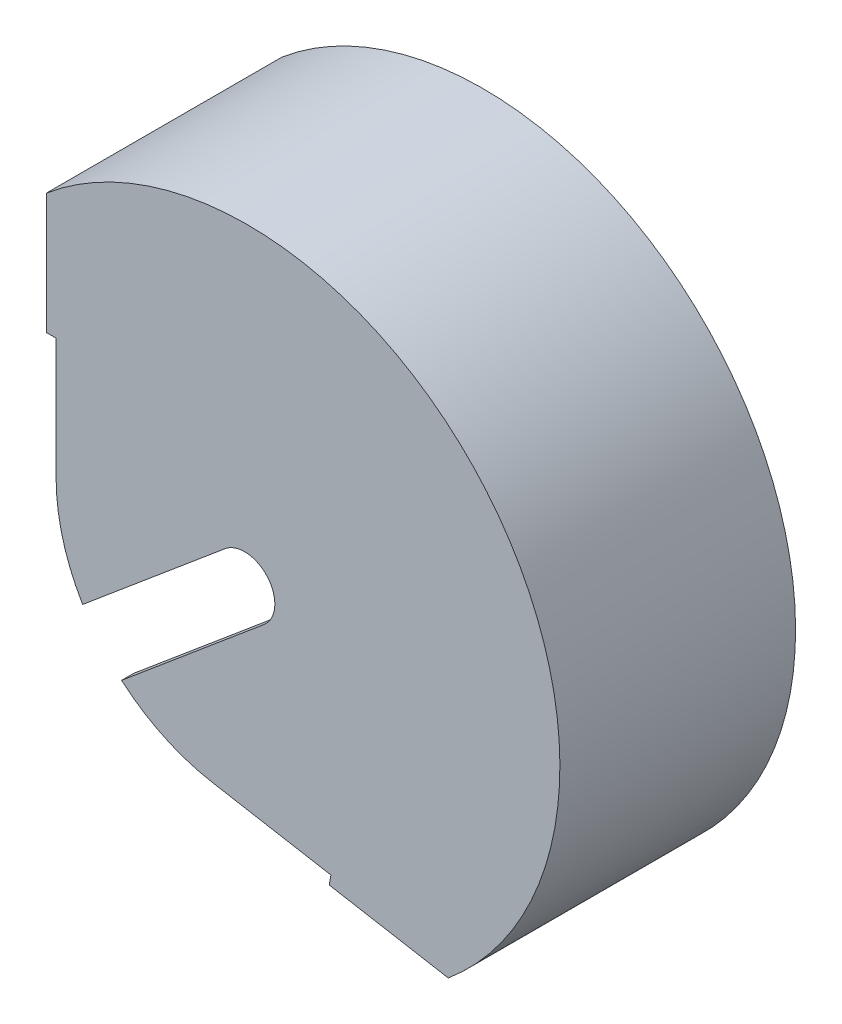
ISO-10303-21;
HEADER;
FILE_DESCRIPTION(('STEP AP214'),'2;1');
FILE_NAME('part.step','',(''),(''),'','','');
FILE_SCHEMA(('AUTOMOTIVE_DESIGN { 1 0 10303 214 1 1 1 1 }'));
ENDSEC;
DATA;
#1=APPLICATION_CONTEXT('core data for automotive mechanical design processes');
#2=APPLICATION_PROTOCOL_DEFINITION('international standard','automotive_design',2000,#1);
#3=PRODUCT_CONTEXT('',#1,'mechanical');
#4=PRODUCT('Part','Part','',(#3));
#5=PRODUCT_RELATED_PRODUCT_CATEGORY('part','',(#4));
#6=PRODUCT_DEFINITION_FORMATION('','',#4);
#7=PRODUCT_DEFINITION_CONTEXT('part definition',#1,'design');
#8=PRODUCT_DEFINITION('design','',#6,#7);
#9=PRODUCT_DEFINITION_SHAPE('','',#8);
#10=(LENGTH_UNIT() NAMED_UNIT(*) SI_UNIT(.MILLI.,.METRE.));
#11=(NAMED_UNIT(*) PLANE_ANGLE_UNIT() SI_UNIT($,.RADIAN.));
#12=(NAMED_UNIT(*) SI_UNIT($,.STERADIAN.) SOLID_ANGLE_UNIT());
#13=UNCERTAINTY_MEASURE_WITH_UNIT(LENGTH_MEASURE(1.E-05),#10,'distance_accuracy_value','');
#14=(GEOMETRIC_REPRESENTATION_CONTEXT(3) GLOBAL_UNCERTAINTY_ASSIGNED_CONTEXT((#13)) GLOBAL_UNIT_ASSIGNED_CONTEXT((#10,
#11,#12)) REPRESENTATION_CONTEXT('',''));
#15=CARTESIAN_POINT('',(0.,0.,0.));
#16=DIRECTION('',(0.,0.,1.));
#17=DIRECTION('',(1.,0.,0.));
#18=AXIS2_PLACEMENT_3D('',#15,#16,#17);
#19=CARTESIAN_POINT('',(0.,0.,46.99));
#20=DIRECTION('',(0.,0.,1.));
#21=DIRECTION('',(1.,0.,0.));
#22=AXIS2_PLACEMENT_3D('',#19,#20,#21);
#23=CYLINDRICAL_SURFACE('',#22,39.624);
#24=DIRECTION('',(0.,0.,1.));
#25=VECTOR('',#24,1.);
#26=CARTESIAN_POINT('',(-34.0431369022995,-20.2762473315773,46.99));
#27=LINE('',#26,#25);
#28=CARTESIAN_POINT('',(-34.0431369022995,-20.2762473315773,46.99));
#29=VERTEX_POINT('',#28);
#30=CARTESIAN_POINT('',(-34.0431369022995,-20.2762473315773,49.53));
#31=VERTEX_POINT('',#30);
#32=EDGE_CURVE('E196',#29,#31,#27,.T.);
#33=ORIENTED_EDGE('',*,*,#32,.T.);
#34=CARTESIAN_POINT('',(0.,0.,49.53));
#35=DIRECTION('',(0.,0.,1.));
#36=DIRECTION('',(1.,0.,0.));
#37=AXIS2_PLACEMENT_3D('',#34,#35,#36);
#38=CIRCLE('',#37,39.624);
#39=CARTESIAN_POINT('',(-39.624,0.,49.53));
#40=VERTEX_POINT('',#39);
#41=EDGE_CURVE('E210',#40,#31,#38,.T.);
#42=ORIENTED_EDGE('',*,*,#41,.F.);
#43=DIRECTION('',(0.,0.,1.));
#44=VECTOR('',#43,1.);
#45=CARTESIAN_POINT('',(-39.624,0.,46.99));
#46=LINE('',#45,#44);
#47=CARTESIAN_POINT('',(-39.624,0.,46.99));
#48=VERTEX_POINT('',#47);
#49=EDGE_CURVE('E234',#48,#40,#46,.T.);
#50=ORIENTED_EDGE('',*,*,#49,.F.);
#51=CARTESIAN_POINT('',(0.,0.,46.99));
#52=DIRECTION('',(0.,0.,1.));
#53=DIRECTION('',(1.,0.,0.));
#54=AXIS2_PLACEMENT_3D('',#51,#52,#53);
#55=CIRCLE('',#54,39.624);
#56=EDGE_CURVE('E212',#48,#29,#55,.T.);
#57=ORIENTED_EDGE('',*,*,#56,.T.);
#58=EDGE_LOOP('',(#33,#42,#50,#57));
#59=FACE_BOUND('',#58,.T.);
#60=ADVANCED_FACE('F44',(#59),#23,.T.);
#61=CARTESIAN_POINT('',(0.,0.,2.54));
#62=DIRECTION('',(0.,0.,1.));
#63=DIRECTION('',(1.,0.,0.));
#64=AXIS2_PLACEMENT_3D('',#61,#62,#63);
#65=PLANE('',#64);
#66=CARTESIAN_POINT('',(0.,0.,2.54));
#67=DIRECTION('',(0.,0.,1.));
#68=DIRECTION('',(1.,0.,0.));
#69=AXIS2_PLACEMENT_3D('',#66,#67,#68);
#70=CIRCLE('',#69,5.08);
#71=CARTESIAN_POINT('',(5.08,0.,2.54));
#72=VERTEX_POINT('',#71);
#73=EDGE_CURVE('E544',#72,#72,#70,.F.);
#74=ORIENTED_EDGE('',*,*,#73,.T.);
#75=EDGE_LOOP('',(#74));
#76=FACE_BOUND('',#75,.T.);
#77=CARTESIAN_POINT('',(2.11621768174401,-33.5316800791596,2.54));
#78=DIRECTION('',(0.,0.,1.));
#79=DIRECTION('',(1.,0.,0.));
#80=AXIS2_PLACEMENT_3D('',#77,#78,#79);
#81=CIRCLE('',#80,3.2639);
#82=CARTESIAN_POINT('',(5.38011768174402,-33.5316800791596,2.54));
#83=VERTEX_POINT('',#82);
#84=EDGE_CURVE('E532',#83,#83,#81,.F.);
#85=ORIENTED_EDGE('',*,*,#84,.T.);
#86=EDGE_LOOP('',(#85));
#87=FACE_BOUND('',#86,.T.);
#88=CARTESIAN_POINT('',(-33.2774928980017,10.1739505809418,2.54));
#89=DIRECTION('',(0.,0.,1.));
#90=DIRECTION('',(1.,0.,0.));
#91=AXIS2_PLACEMENT_3D('',#88,#89,#90);
#92=CIRCLE('',#91,3.2639);
#93=CARTESIAN_POINT('',(-30.0135928980017,10.1739505809418,2.54));
#94=VERTEX_POINT('',#93);
#95=EDGE_CURVE('E528',#94,#94,#92,.F.);
#96=ORIENTED_EDGE('',*,*,#95,.T.);
#97=EDGE_LOOP('',(#96));
#98=FACE_BOUND('',#97,.T.);
#99=CARTESIAN_POINT('',(0.569372682063345,0.477760407521777,2.54));
#100=DIRECTION('',(0.,0.,1.));
#101=DIRECTION('',(1.,0.,0.));
#102=AXIS2_PLACEMENT_3D('',#99,#100,#101);
#103=CIRCLE('',#102,63.1510183795466);
#104=CARTESIAN_POINT('',(41.1620648355229,-47.8987262994342,2.54));
#105=VERTEX_POINT('',#104);
#106=CARTESIAN_POINT('',(-40.0233194713961,48.8542471144778,2.54));
#107=VERTEX_POINT('',#106);
#108=EDGE_CURVE('E68',#105,#107,#103,.T.);
#109=ORIENTED_EDGE('',*,*,#108,.T.);
#110=DIRECTION('',(-1.,0.,0.));
#111=VECTOR('',#110,1.);
#112=CARTESIAN_POINT('',(0.,48.8542471144778,2.54));
#113=LINE('',#112,#111);
#114=CARTESIAN_POINT('',(-41.656,48.8542471144778,2.54));
#115=VERTEX_POINT('',#114);
#116=EDGE_CURVE('E260',#107,#115,#113,.T.);
#117=ORIENTED_EDGE('',*,*,#116,.T.);
#118=DIRECTION('',(0.,1.,0.));
#119=VECTOR('',#118,1.);
#120=CARTESIAN_POINT('',(-41.656,0.,2.54));
#121=LINE('',#120,#119);
#122=CARTESIAN_POINT('',(-41.656,25.4,2.54));
#123=VERTEX_POINT('',#122);
#124=EDGE_CURVE('E308',#123,#115,#121,.T.);
#125=ORIENTED_EDGE('',*,*,#124,.F.);
#126=DIRECTION('',(-1.,0.,0.));
#127=VECTOR('',#126,1.);
#128=CARTESIAN_POINT('',(0.,25.4,2.54));
#129=LINE('',#128,#127);
#130=CARTESIAN_POINT('',(-39.624,25.4,2.54));
#131=VERTEX_POINT('',#130);
#132=EDGE_CURVE('E312',#131,#123,#129,.T.);
#133=ORIENTED_EDGE('',*,*,#132,.F.);
#134=DIRECTION('',(0.,1.,0.));
#135=VECTOR('',#134,1.);
#136=CARTESIAN_POINT('',(-39.624,0.,2.54));
#137=LINE('',#136,#135);
#138=CARTESIAN_POINT('',(-39.624,0.,2.54));
#139=VERTEX_POINT('',#138);
#140=EDGE_CURVE('E291',#139,#131,#137,.T.);
#141=ORIENTED_EDGE('',*,*,#140,.F.);
#142=CARTESIAN_POINT('',(0.,0.,2.54));
#143=DIRECTION('',(0.,0.,1.));
#144=DIRECTION('',(1.,0.,0.));
#145=AXIS2_PLACEMENT_3D('',#142,#143,#144);
#146=CIRCLE('',#145,39.624);
#147=CARTESIAN_POINT('',(-6.88063539187432,-39.0220224053558,2.54));
#148=VERTEX_POINT('',#147);
#149=EDGE_CURVE('E295',#139,#148,#146,.T.);
#150=ORIENTED_EDGE('',*,*,#149,.T.);
#151=DIRECTION('',(0.984807753012209,-0.173648177666927,0.));
#152=VECTOR('',#151,1.);
#153=CARTESIAN_POINT('',(-6.88063539187431,-39.0220224053558,2.54));
#154=LINE('',#153,#152);
#155=CARTESIAN_POINT('',(18.1334815346358,-43.4326861180957,2.54));
#156=VERTEX_POINT('',#155);
#157=EDGE_CURVE('E299',#148,#156,#154,.T.);
#158=ORIENTED_EDGE('',*,*,#157,.T.);
#159=DIRECTION('',(-0.173648177666925,-0.984807753012209,0.));
#160=VECTOR('',#159,1.);
#161=CARTESIAN_POINT('',(25.01411692651,-4.41066371273988,2.54));
#162=LINE('',#161,#160);
#163=CARTESIAN_POINT('',(17.7806284376166,-45.4338154722165,2.54));
#164=VERTEX_POINT('',#163);
#165=EDGE_CURVE('E302',#156,#164,#162,.T.);
#166=ORIENTED_EDGE('',*,*,#165,.T.);
#167=DIRECTION('',(0.984807753012209,-0.173648177666927,0.));
#168=VECTOR('',#167,1.);
#169=CARTESIAN_POINT('',(-7.23348848889351,-41.0231517594766,2.54));
#170=LINE('',#169,#168);
#171=CARTESIAN_POINT('',(40.8785528370185,-49.5066027421954,2.54));
#172=VERTEX_POINT('',#171);
#173=EDGE_CURVE('E305',#164,#172,#170,.T.);
#174=ORIENTED_EDGE('',*,*,#173,.T.);
#175=DIRECTION('',(-0.173648177666925,-0.984807753012209,0.));
#176=VECTOR('',#175,1.);
#177=CARTESIAN_POINT('',(48.112041325912,-8.48345098271867,2.54));
#178=LINE('',#177,#176);
#179=EDGE_CURVE('E270',#105,#172,#178,.T.);
#180=ORIENTED_EDGE('',*,*,#179,.F.);
#181=EDGE_LOOP('',(#109,#117,#125,#133,#141,#150,#158,#166,#174,#180));
#182=FACE_BOUND('',#181,.T.);
#183=ADVANCED_FACE('F388',(#76,#87,#98,#182),#65,.T.);
#184=CARTESIAN_POINT('',(-39.624,0.,2.54));
#185=DIRECTION('',(-1.,0.,0.));
#186=DIRECTION('',(0.,0.,1.));
#187=AXIS2_PLACEMENT_3D('',#184,#185,#186);
#188=PLANE('',#187);
#189=DIRECTION('',(0.,1.,0.));
#190=VECTOR('',#189,1.);
#191=CARTESIAN_POINT('',(-39.624,0.,0.));
#192=LINE('',#191,#190);
#193=CARTESIAN_POINT('',(-39.624,0.,0.));
#194=VERTEX_POINT('',#193);
#195=CARTESIAN_POINT('',(-39.624,25.4,0.));
#196=VERTEX_POINT('',#195);
#197=EDGE_CURVE('E290',#194,#196,#192,.T.);
#198=ORIENTED_EDGE('',*,*,#197,.F.);
#199=DIRECTION('',(0.,0.,-1.));
#200=VECTOR('',#199,1.);
#201=CARTESIAN_POINT('',(-39.624,0.,2.54));
#202=LINE('',#201,#200);
#203=EDGE_CURVE('E11',#139,#194,#202,.T.);
#204=ORIENTED_EDGE('',*,*,#203,.F.);
#205=ORIENTED_EDGE('',*,*,#140,.T.);
#206=DIRECTION('',(0.,0.,-1.));
#207=VECTOR('',#206,1.);
#208=CARTESIAN_POINT('',(-39.624,25.4,2.54));
#209=LINE('',#208,#207);
#210=EDGE_CURVE('E316',#131,#196,#209,.T.);
#211=ORIENTED_EDGE('',*,*,#210,.T.);
#212=EDGE_LOOP('',(#198,#204,#205,#211));
#213=FACE_BOUND('',#212,.T.);
#214=ADVANCED_FACE('F46',(#213),#188,.T.);
#215=CARTESIAN_POINT('',(0.,0.,2.54));
#216=DIRECTION('',(0.,0.,-1.));
#217=DIRECTION('',(-1.,0.,0.));
#218=AXIS2_PLACEMENT_3D('',#215,#216,#217);
#219=CYLINDRICAL_SURFACE('',#218,39.624);
#220=CARTESIAN_POINT('',(0.,0.,0.));
#221=DIRECTION('',(0.,0.,1.));
#222=DIRECTION('',(1.,0.,0.));
#223=AXIS2_PLACEMENT_3D('',#220,#221,#222);
#224=CIRCLE('',#223,39.624);
#225=CARTESIAN_POINT('',(-6.88063539187432,-39.0220224053558,0.));
#226=VERTEX_POINT('',#225);
#227=EDGE_CURVE('E320',#194,#226,#224,.T.);
#228=ORIENTED_EDGE('',*,*,#227,.T.);
#229=DIRECTION('',(0.,0.,-1.));
#230=VECTOR('',#229,1.);
#231=CARTESIAN_POINT('',(-6.88063539187432,-39.0220224053558,2.54));
#232=LINE('',#231,#230);
#233=EDGE_CURVE('E53',#148,#226,#232,.T.);
#234=ORIENTED_EDGE('',*,*,#233,.F.);
#235=ORIENTED_EDGE('',*,*,#149,.F.);
#236=ORIENTED_EDGE('',*,*,#203,.T.);
#237=EDGE_LOOP('',(#228,#234,#235,#236));
#238=FACE_BOUND('',#237,.T.);
#239=ADVANCED_FACE('F411',(#238),#219,.T.);
#240=CARTESIAN_POINT('',(-6.88063539187431,-39.0220224053558,2.54));
#241=DIRECTION('',(0.173648177666927,0.984807753012209,0.));
#242=DIRECTION('',(-0.984807753012209,0.173648177666927,0.));
#243=AXIS2_PLACEMENT_3D('',#240,#241,#242);
#244=PLANE('',#243);
#245=DIRECTION('',(0.984807753012209,-0.173648177666927,0.));
#246=VECTOR('',#245,1.);
#247=CARTESIAN_POINT('',(-6.88063539187431,-39.0220224053558,0.));
#248=LINE('',#247,#246);
#249=CARTESIAN_POINT('',(18.1334815346358,-43.4326861180957,0.));
#250=VERTEX_POINT('',#249);
#251=EDGE_CURVE('E323',#226,#250,#248,.T.);
#252=ORIENTED_EDGE('',*,*,#251,.T.);
#253=DIRECTION('',(0.,0.,-1.));
#254=VECTOR('',#253,1.);
#255=CARTESIAN_POINT('',(18.1334815346358,-43.4326861180957,2.54));
#256=LINE('',#255,#254);
#257=EDGE_CURVE('E359',#156,#250,#256,.T.);
#258=ORIENTED_EDGE('',*,*,#257,.F.);
#259=ORIENTED_EDGE('',*,*,#157,.F.);
#260=ORIENTED_EDGE('',*,*,#233,.T.);
#261=EDGE_LOOP('',(#252,#258,#259,#260));
#262=FACE_BOUND('',#261,.T.);
#263=ADVANCED_FACE('F368',(#262),#244,.F.);
#264=CARTESIAN_POINT('',(25.01411692651,-4.41066371273988,2.54));
#265=DIRECTION('',(0.984807753012209,-0.173648177666925,0.));
#266=DIRECTION('',(0.173648177666925,0.984807753012209,0.));
#267=AXIS2_PLACEMENT_3D('',#264,#265,#266);
#268=PLANE('',#267);
#269=DIRECTION('',(-0.173648177666925,-0.984807753012209,0.));
#270=VECTOR('',#269,1.);
#271=CARTESIAN_POINT('',(25.01411692651,-4.41066371273988,0.));
#272=LINE('',#271,#270);
#273=CARTESIAN_POINT('',(17.7806284376166,-45.4338154722165,0.));
#274=VERTEX_POINT('',#273);
#275=EDGE_CURVE('E326',#250,#274,#272,.T.);
#276=ORIENTED_EDGE('',*,*,#275,.T.);
#277=DIRECTION('',(0.,0.,-1.));
#278=VECTOR('',#277,1.);
#279=CARTESIAN_POINT('',(17.7806284376166,-45.4338154722165,2.54));
#280=LINE('',#279,#278);
#281=EDGE_CURVE('E355',#164,#274,#280,.T.);
#282=ORIENTED_EDGE('',*,*,#281,.F.);
#283=ORIENTED_EDGE('',*,*,#165,.F.);
#284=ORIENTED_EDGE('',*,*,#257,.T.);
#285=EDGE_LOOP('',(#276,#282,#283,#284));
#286=FACE_BOUND('',#285,.T.);
#287=ADVANCED_FACE('F381',(#286),#268,.F.);
#288=CARTESIAN_POINT('',(-7.23348848889351,-41.0231517594766,2.54));
#289=DIRECTION('',(0.173648177666927,0.984807753012209,0.));
#290=DIRECTION('',(-0.984807753012209,0.173648177666927,0.));
#291=AXIS2_PLACEMENT_3D('',#288,#289,#290);
#292=PLANE('',#291);
#293=DIRECTION('',(0.984807753012209,-0.173648177666927,0.));
#294=VECTOR('',#293,1.);
#295=CARTESIAN_POINT('',(-7.23348848889351,-41.0231517594766,0.));
#296=LINE('',#295,#294);
#297=CARTESIAN_POINT('',(42.7947453641267,-49.8444791849564,0.));
#298=VERTEX_POINT('',#297);
#299=EDGE_CURVE('E329',#274,#298,#296,.T.);
#300=ORIENTED_EDGE('',*,*,#299,.T.);
#301=DIRECTION('',(0.,0.,-1.));
#302=VECTOR('',#301,1.);
#303=CARTESIAN_POINT('',(42.7947453641267,-49.8444791849564,2.54));
#304=LINE('',#303,#302);
#305=CARTESIAN_POINT('',(42.7947453641267,-49.8444791849564,49.53));
#306=VERTEX_POINT('',#305);
#307=EDGE_CURVE('E351',#306,#298,#304,.T.);
#308=ORIENTED_EDGE('',*,*,#307,.F.);
#309=DIRECTION('',(0.984807753012209,-0.173648177666927,0.));
#310=VECTOR('',#309,1.);
#311=CARTESIAN_POINT('',(-7.23348848889351,-41.0231517594766,49.53));
#312=LINE('',#311,#310);
#313=CARTESIAN_POINT('',(17.7806284376166,-45.4338154722165,49.53));
#314=VERTEX_POINT('',#313);
#315=EDGE_CURVE('E478',#314,#306,#312,.T.);
#316=ORIENTED_EDGE('',*,*,#315,.F.);
#317=DIRECTION('',(0.,0.,1.));
#318=VECTOR('',#317,1.);
#319=CARTESIAN_POINT('',(17.7806284376166,-45.4338154722165,46.99));
#320=LINE('',#319,#318);
#321=CARTESIAN_POINT('',(17.7806284376166,-45.4338154722165,46.99));
#322=VERTEX_POINT('',#321);
#323=EDGE_CURVE('E244',#322,#314,#320,.T.);
#324=ORIENTED_EDGE('',*,*,#323,.F.);
#325=DIRECTION('',(0.984807753012209,-0.173648177666927,0.));
#326=VECTOR('',#325,1.);
#327=CARTESIAN_POINT('',(-7.23348848889351,-41.0231517594766,46.99));
#328=LINE('',#327,#326);
#329=CARTESIAN_POINT('',(40.8785528370185,-49.5066027421954,46.99));
#330=VERTEX_POINT('',#329);
#331=EDGE_CURVE('E515',#322,#330,#328,.T.);
#332=ORIENTED_EDGE('',*,*,#331,.T.);
#333=DIRECTION('',(0.,0.,-1.));
#334=VECTOR('',#333,1.);
#335=CARTESIAN_POINT('',(40.8785528370185,-49.5066027421954,46.99));
#336=LINE('',#335,#334);
#337=EDGE_CURVE('E282',#330,#172,#336,.T.);
#338=ORIENTED_EDGE('',*,*,#337,.T.);
#339=ORIENTED_EDGE('',*,*,#173,.F.);
#340=ORIENTED_EDGE('',*,*,#281,.T.);
#341=EDGE_LOOP('',(#300,#308,#316,#324,#332,#338,#339,#340));
#342=FACE_BOUND('',#341,.T.);
#343=ADVANCED_FACE('F385',(#342),#292,.F.);
#344=CARTESIAN_POINT('',(0.569372682063345,0.477760407521777,2.54));
#345=DIRECTION('',(0.,0.,-1.));
#346=DIRECTION('',(-1.,0.,0.));
#347=AXIS2_PLACEMENT_3D('',#344,#345,#346);
#348=CYLINDRICAL_SURFACE('',#347,65.6910183795466);
#349=CARTESIAN_POINT('',(0.569372682063345,0.477760407521777,0.));
#350=DIRECTION('',(0.,0.,1.));
#351=DIRECTION('',(1.,0.,0.));
#352=AXIS2_PLACEMENT_3D('',#349,#350,#351);
#353=CIRCLE('',#352,65.6910183795466);
#354=CARTESIAN_POINT('',(-41.656,50.8,0.));
#355=VERTEX_POINT('',#354);
#356=EDGE_CURVE('E332',#298,#355,#353,.T.);
#357=ORIENTED_EDGE('',*,*,#356,.T.);
#358=DIRECTION('',(0.,0.,-1.));
#359=VECTOR('',#358,1.);
#360=CARTESIAN_POINT('',(-41.656,50.8,2.54));
#361=LINE('',#360,#359);
#362=CARTESIAN_POINT('',(-41.656,50.8,49.53));
#363=VERTEX_POINT('',#362);
#364=EDGE_CURVE('E348',#363,#355,#361,.T.);
#365=ORIENTED_EDGE('',*,*,#364,.F.);
#366=CARTESIAN_POINT('',(0.569372682063345,0.477760407521777,49.53));
#367=DIRECTION('',(0.,0.,1.));
#368=DIRECTION('',(1.,0.,0.));
#369=AXIS2_PLACEMENT_3D('',#366,#367,#368);
#370=CIRCLE('',#369,65.6910183795466);
#371=EDGE_CURVE('E474',#306,#363,#370,.T.);
#372=ORIENTED_EDGE('',*,*,#371,.F.);
#373=ORIENTED_EDGE('',*,*,#307,.T.);
#374=EDGE_LOOP('',(#357,#365,#372,#373));
#375=FACE_BOUND('',#374,.T.);
#376=ADVANCED_FACE('F495',(#375),#348,.T.);
#377=CARTESIAN_POINT('',(-41.656,0.,2.54));
#378=DIRECTION('',(-1.,0.,0.));
#379=DIRECTION('',(0.,0.,1.));
#380=AXIS2_PLACEMENT_3D('',#377,#378,#379);
#381=PLANE('',#380);
#382=DIRECTION('',(0.,1.,0.));
#383=VECTOR('',#382,1.);
#384=CARTESIAN_POINT('',(-41.656,0.,0.));
#385=LINE('',#384,#383);
#386=CARTESIAN_POINT('',(-41.656,25.4,0.));
#387=VERTEX_POINT('',#386);
#388=EDGE_CURVE('E336',#387,#355,#385,.T.);
#389=ORIENTED_EDGE('',*,*,#388,.F.);
#390=DIRECTION('',(0.,0.,-1.));
#391=VECTOR('',#390,1.);
#392=CARTESIAN_POINT('',(-41.656,25.4,2.54));
#393=LINE('',#392,#391);
#394=EDGE_CURVE('E345',#123,#387,#393,.T.);
#395=ORIENTED_EDGE('',*,*,#394,.F.);
#396=ORIENTED_EDGE('',*,*,#124,.T.);
#397=DIRECTION('',(0.,0.,-1.));
#398=VECTOR('',#397,1.);
#399=CARTESIAN_POINT('',(-41.656,48.8542471144778,46.99));
#400=LINE('',#399,#398);
#401=CARTESIAN_POINT('',(-41.656,48.8542471144778,46.99));
#402=VERTEX_POINT('',#401);
#403=EDGE_CURVE('E278',#402,#115,#400,.T.);
#404=ORIENTED_EDGE('',*,*,#403,.F.);
#405=DIRECTION('',(0.,1.,0.));
#406=VECTOR('',#405,1.);
#407=CARTESIAN_POINT('',(-41.656,0.,46.99));
#408=LINE('',#407,#406);
#409=CARTESIAN_POINT('',(-41.656,25.4,46.99));
#410=VERTEX_POINT('',#409);
#411=EDGE_CURVE('E497',#410,#402,#408,.T.);
#412=ORIENTED_EDGE('',*,*,#411,.F.);
#413=DIRECTION('',(0.,0.,1.));
#414=VECTOR('',#413,1.);
#415=CARTESIAN_POINT('',(-41.656,25.4,46.99));
#416=LINE('',#415,#414);
#417=CARTESIAN_POINT('',(-41.656,25.4,49.53));
#418=VERTEX_POINT('',#417);
#419=EDGE_CURVE('E247',#410,#418,#416,.T.);
#420=ORIENTED_EDGE('',*,*,#419,.T.);
#421=DIRECTION('',(0.,1.,0.));
#422=VECTOR('',#421,1.);
#423=CARTESIAN_POINT('',(-41.656,0.,49.53));
#424=LINE('',#423,#422);
#425=EDGE_CURVE('E470',#418,#363,#424,.T.);
#426=ORIENTED_EDGE('',*,*,#425,.T.);
#427=ORIENTED_EDGE('',*,*,#364,.T.);
#428=EDGE_LOOP('',(#389,#395,#396,#404,#412,#420,#426,#427));
#429=FACE_BOUND('',#428,.T.);
#430=ADVANCED_FACE('F404',(#429),#381,.T.);
#431=CARTESIAN_POINT('',(0.,25.4,2.54));
#432=DIRECTION('',(0.,-1.,0.));
#433=DIRECTION('',(0.,0.,-1.));
#434=AXIS2_PLACEMENT_3D('',#431,#432,#433);
#435=PLANE('',#434);
#436=DIRECTION('',(-1.,0.,0.));
#437=VECTOR('',#436,1.);
#438=CARTESIAN_POINT('',(0.,25.4,0.));
#439=LINE('',#438,#437);
#440=EDGE_CURVE('E296',#196,#387,#439,.T.);
#441=ORIENTED_EDGE('',*,*,#440,.F.);
#442=ORIENTED_EDGE('',*,*,#210,.F.);
#443=ORIENTED_EDGE('',*,*,#132,.T.);
#444=ORIENTED_EDGE('',*,*,#394,.T.);
#445=EDGE_LOOP('',(#441,#442,#443,#444));
#446=FACE_BOUND('',#445,.T.);
#447=ADVANCED_FACE('F408',(#446),#435,.T.);
#448=CARTESIAN_POINT('',(0.,0.,0.));
#449=DIRECTION('',(0.,0.,1.));
#450=DIRECTION('',(1.,0.,0.));
#451=AXIS2_PLACEMENT_3D('',#448,#449,#450);
#452=PLANE('',#451);
#453=CARTESIAN_POINT('',(0.,0.,0.));
#454=DIRECTION('',(0.,0.,-1.));
#455=DIRECTION('',(-1.,0.,0.));
#456=AXIS2_PLACEMENT_3D('',#453,#454,#455);
#457=CIRCLE('',#456,5.08);
#458=CARTESIAN_POINT('',(-5.08,0.,0.));
#459=VERTEX_POINT('',#458);
#460=EDGE_CURVE('E537',#459,#459,#457,.T.);
#461=ORIENTED_EDGE('',*,*,#460,.F.);
#462=EDGE_LOOP('',(#461));
#463=FACE_BOUND('',#462,.T.);
#464=CARTESIAN_POINT('',(2.11621768174401,-33.5316800791596,0.));
#465=DIRECTION('',(0.,0.,-1.));
#466=DIRECTION('',(-1.,0.,0.));
#467=AXIS2_PLACEMENT_3D('',#464,#465,#466);
#468=CIRCLE('',#467,3.2639);
#469=CARTESIAN_POINT('',(-1.14768231825599,-33.5316800791596,0.));
#470=VERTEX_POINT('',#469);
#471=EDGE_CURVE('E215',#470,#470,#468,.T.);
#472=ORIENTED_EDGE('',*,*,#471,.F.);
#473=EDGE_LOOP('',(#472));
#474=FACE_BOUND('',#473,.T.);
#475=CARTESIAN_POINT('',(-33.2774928980017,10.1739505809418,0.));
#476=DIRECTION('',(0.,0.,-1.));
#477=DIRECTION('',(-1.,0.,0.));
#478=AXIS2_PLACEMENT_3D('',#475,#476,#477);
#479=CIRCLE('',#478,3.2639);
#480=CARTESIAN_POINT('',(-36.5413928980017,10.1739505809418,0.));
#481=VERTEX_POINT('',#480);
#482=EDGE_CURVE('E533',#481,#481,#479,.T.);
#483=ORIENTED_EDGE('',*,*,#482,.F.);
#484=EDGE_LOOP('',(#483));
#485=FACE_BOUND('',#484,.T.);
#486=ORIENTED_EDGE('',*,*,#197,.T.);
#487=ORIENTED_EDGE('',*,*,#440,.T.);
#488=ORIENTED_EDGE('',*,*,#388,.T.);
#489=ORIENTED_EDGE('',*,*,#356,.F.);
#490=ORIENTED_EDGE('',*,*,#299,.F.);
#491=ORIENTED_EDGE('',*,*,#275,.F.);
#492=ORIENTED_EDGE('',*,*,#251,.F.);
#493=ORIENTED_EDGE('',*,*,#227,.F.);
#494=EDGE_LOOP('',(#486,#487,#488,#489,#490,#491,#492,#493));
#495=FACE_BOUND('',#494,.T.);
#496=ADVANCED_FACE('F375',(#463,#474,#485,#495),#452,.F.);
#497=CARTESIAN_POINT('',(0.569372682063345,0.477760407521777,46.99));
#498=DIRECTION('',(0.,0.,-1.));
#499=DIRECTION('',(-1.,0.,0.));
#500=AXIS2_PLACEMENT_3D('',#497,#498,#499);
#501=CYLINDRICAL_SURFACE('',#500,63.1510183795466);
#502=ORIENTED_EDGE('',*,*,#108,.F.);
#503=DIRECTION('',(0.,0.,-1.));
#504=VECTOR('',#503,1.);
#505=CARTESIAN_POINT('',(41.1620648355229,-47.8987262994342,46.99));
#506=LINE('',#505,#504);
#507=CARTESIAN_POINT('',(41.1620648355229,-47.8987262994342,46.99));
#508=VERTEX_POINT('',#507);
#509=EDGE_CURVE('E286',#508,#105,#506,.T.);
#510=ORIENTED_EDGE('',*,*,#509,.F.);
#511=CARTESIAN_POINT('',(0.569372682063345,0.477760407521777,46.99));
#512=DIRECTION('',(0.,0.,1.));
#513=DIRECTION('',(1.,0.,0.));
#514=AXIS2_PLACEMENT_3D('',#511,#512,#513);
#515=CIRCLE('',#514,63.1510183795466);
#516=CARTESIAN_POINT('',(-40.0233194713961,48.8542471144778,46.99));
#517=VERTEX_POINT('',#516);
#518=EDGE_CURVE('E255',#508,#517,#515,.T.);
#519=ORIENTED_EDGE('',*,*,#518,.T.);
#520=DIRECTION('',(0.,0.,-1.));
#521=VECTOR('',#520,1.);
#522=CARTESIAN_POINT('',(-40.0233194713961,48.8542471144778,46.99));
#523=LINE('',#522,#521);
#524=EDGE_CURVE('E267',#517,#107,#523,.T.);
#525=ORIENTED_EDGE('',*,*,#524,.T.);
#526=EDGE_LOOP('',(#502,#510,#519,#525));
#527=FACE_BOUND('',#526,.T.);
#528=ADVANCED_FACE('F394',(#527),#501,.F.);
#529=CARTESIAN_POINT('',(48.112041325912,-8.48345098271867,46.99));
#530=DIRECTION('',(0.984807753012209,-0.173648177666925,0.));
#531=DIRECTION('',(0.173648177666925,0.984807753012209,0.));
#532=AXIS2_PLACEMENT_3D('',#529,#530,#531);
#533=PLANE('',#532);
#534=ORIENTED_EDGE('',*,*,#179,.T.);
#535=ORIENTED_EDGE('',*,*,#337,.F.);
#536=DIRECTION('',(-0.173648177666925,-0.984807753012209,0.));
#537=VECTOR('',#536,1.);
#538=CARTESIAN_POINT('',(48.112041325912,-8.48345098271867,46.99));
#539=LINE('',#538,#537);
#540=EDGE_CURVE('E259',#508,#330,#539,.T.);
#541=ORIENTED_EDGE('',*,*,#540,.F.);
#542=ORIENTED_EDGE('',*,*,#509,.T.);
#543=EDGE_LOOP('',(#534,#535,#541,#542));
#544=FACE_BOUND('',#543,.T.);
#545=ADVANCED_FACE('F390',(#544),#533,.F.);
#546=CARTESIAN_POINT('',(0.,48.8542471144778,46.99));
#547=DIRECTION('',(0.,-1.,0.));
#548=DIRECTION('',(0.,0.,-1.));
#549=AXIS2_PLACEMENT_3D('',#546,#547,#548);
#550=PLANE('',#549);
#551=ORIENTED_EDGE('',*,*,#116,.F.);
#552=ORIENTED_EDGE('',*,*,#524,.F.);
#553=DIRECTION('',(-1.,0.,0.));
#554=VECTOR('',#553,1.);
#555=CARTESIAN_POINT('',(0.,48.8542471144778,46.99));
#556=LINE('',#555,#554);
#557=EDGE_CURVE('E263',#517,#402,#556,.T.);
#558=ORIENTED_EDGE('',*,*,#557,.T.);
#559=ORIENTED_EDGE('',*,*,#403,.T.);
#560=EDGE_LOOP('',(#551,#552,#558,#559));
#561=FACE_BOUND('',#560,.T.);
#562=ADVANCED_FACE('F398',(#561),#550,.T.);
#563=CARTESIAN_POINT('',(-39.624,0.,46.99));
#564=DIRECTION('',(1.,0.,0.));
#565=DIRECTION('',(0.,0.,-1.));
#566=AXIS2_PLACEMENT_3D('',#563,#564,#565);
#567=PLANE('',#566);
#568=DIRECTION('',(0.,1.,0.));
#569=VECTOR('',#568,1.);
#570=CARTESIAN_POINT('',(-39.624,0.,49.53));
#571=LINE('',#570,#569);
#572=CARTESIAN_POINT('',(-39.624,25.4,49.53));
#573=VERTEX_POINT('',#572);
#574=EDGE_CURVE('E220',#40,#573,#571,.T.);
#575=ORIENTED_EDGE('',*,*,#574,.T.);
#576=DIRECTION('',(0.,0.,1.));
#577=VECTOR('',#576,1.);
#578=CARTESIAN_POINT('',(-39.624,25.4,46.99));
#579=LINE('',#578,#577);
#580=CARTESIAN_POINT('',(-39.624,25.4,46.99));
#581=VERTEX_POINT('',#580);
#582=EDGE_CURVE('E251',#581,#573,#579,.T.);
#583=ORIENTED_EDGE('',*,*,#582,.F.);
#584=DIRECTION('',(0.,1.,0.));
#585=VECTOR('',#584,1.);
#586=CARTESIAN_POINT('',(-39.624,0.,46.99));
#587=LINE('',#586,#585);
#588=EDGE_CURVE('E222',#48,#581,#587,.T.);
#589=ORIENTED_EDGE('',*,*,#588,.F.);
#590=ORIENTED_EDGE('',*,*,#49,.T.);
#591=EDGE_LOOP('',(#575,#583,#589,#590));
#592=FACE_BOUND('',#591,.T.);
#593=ADVANCED_FACE('F503',(#592),#567,.F.);
#594=CARTESIAN_POINT('',(0.,25.4,46.99));
#595=DIRECTION('',(0.,1.,0.));
#596=DIRECTION('',(0.,0.,1.));
#597=AXIS2_PLACEMENT_3D('',#594,#595,#596);
#598=PLANE('',#597);
#599=DIRECTION('',(-1.,0.,0.));
#600=VECTOR('',#599,1.);
#601=CARTESIAN_POINT('',(0.,25.4,49.53));
#602=LINE('',#601,#600);
#603=EDGE_CURVE('E466',#573,#418,#602,.T.);
#604=ORIENTED_EDGE('',*,*,#603,.T.);
#605=ORIENTED_EDGE('',*,*,#419,.F.);
#606=DIRECTION('',(-1.,0.,0.));
#607=VECTOR('',#606,1.);
#608=CARTESIAN_POINT('',(0.,25.4,46.99));
#609=LINE('',#608,#607);
#610=EDGE_CURVE('E228',#581,#410,#609,.T.);
#611=ORIENTED_EDGE('',*,*,#610,.F.);
#612=ORIENTED_EDGE('',*,*,#582,.T.);
#613=EDGE_LOOP('',(#604,#605,#611,#612));
#614=FACE_BOUND('',#613,.T.);
#615=ADVANCED_FACE('F499',(#614),#598,.F.);
#616=CARTESIAN_POINT('',(25.01411692651,-4.41066371273988,46.99));
#617=DIRECTION('',(-0.984807753012209,0.173648177666925,0.));
#618=DIRECTION('',(-0.173648177666925,-0.984807753012209,0.));
#619=AXIS2_PLACEMENT_3D('',#616,#617,#618);
#620=PLANE('',#619);
#621=DIRECTION('',(-0.173648177666925,-0.984807753012209,0.));
#622=VECTOR('',#621,1.);
#623=CARTESIAN_POINT('',(25.01411692651,-4.41066371273988,49.53));
#624=LINE('',#623,#622);
#625=CARTESIAN_POINT('',(18.1334815346358,-43.4326861180957,49.53));
#626=VERTEX_POINT('',#625);
#627=EDGE_CURVE('E481',#626,#314,#624,.T.);
#628=ORIENTED_EDGE('',*,*,#627,.F.);
#629=DIRECTION('',(0.,0.,1.));
#630=VECTOR('',#629,1.);
#631=CARTESIAN_POINT('',(18.1334815346358,-43.4326861180957,46.99));
#632=LINE('',#631,#630);
#633=CARTESIAN_POINT('',(18.1334815346358,-43.4326861180957,46.99));
#634=VERTEX_POINT('',#633);
#635=EDGE_CURVE('E241',#634,#626,#632,.T.);
#636=ORIENTED_EDGE('',*,*,#635,.F.);
#637=DIRECTION('',(-0.173648177666925,-0.984807753012209,0.));
#638=VECTOR('',#637,1.);
#639=CARTESIAN_POINT('',(25.01411692651,-4.41066371273988,46.99));
#640=LINE('',#639,#638);
#641=EDGE_CURVE('E460',#634,#322,#640,.T.);
#642=ORIENTED_EDGE('',*,*,#641,.T.);
#643=ORIENTED_EDGE('',*,*,#323,.T.);
#644=EDGE_LOOP('',(#628,#636,#642,#643));
#645=FACE_BOUND('',#644,.T.);
#646=ADVANCED_FACE('F439',(#645),#620,.T.);
#647=CARTESIAN_POINT('',(-6.88063539187431,-39.0220224053558,46.99));
#648=DIRECTION('',(-0.173648177666927,-0.984807753012209,0.));
#649=DIRECTION('',(0.984807753012209,-0.173648177666927,0.));
#650=AXIS2_PLACEMENT_3D('',#647,#648,#649);
#651=PLANE('',#650);
#652=DIRECTION('',(0.984807753012209,-0.173648177666927,0.));
#653=VECTOR('',#652,1.);
#654=CARTESIAN_POINT('',(-6.88063539187431,-39.0220224053558,49.53));
#655=LINE('',#654,#653);
#656=CARTESIAN_POINT('',(-6.88063539187432,-39.0220224053558,49.53));
#657=VERTEX_POINT('',#656);
#658=EDGE_CURVE('E230',#657,#626,#655,.T.);
#659=ORIENTED_EDGE('',*,*,#658,.F.);
#660=DIRECTION('',(0.,0.,1.));
#661=VECTOR('',#660,1.);
#662=CARTESIAN_POINT('',(-6.88063539187432,-39.0220224053558,46.99));
#663=LINE('',#662,#661);
#664=CARTESIAN_POINT('',(-6.88063539187432,-39.0220224053558,46.99));
#665=VERTEX_POINT('',#664);
#666=EDGE_CURVE('E237',#665,#657,#663,.T.);
#667=ORIENTED_EDGE('',*,*,#666,.F.);
#668=DIRECTION('',(0.984807753012209,-0.173648177666927,0.));
#669=VECTOR('',#668,1.);
#670=CARTESIAN_POINT('',(-6.88063539187431,-39.0220224053558,46.99));
#671=LINE('',#670,#669);
#672=EDGE_CURVE('E455',#665,#634,#671,.T.);
#673=ORIENTED_EDGE('',*,*,#672,.T.);
#674=ORIENTED_EDGE('',*,*,#635,.T.);
#675=EDGE_LOOP('',(#659,#667,#673,#674));
#676=FACE_BOUND('',#675,.T.);
#677=ADVANCED_FACE('F431',(#676),#651,.T.);
#678=DIRECTION('',(0.,0.,1.));
#679=VECTOR('',#678,1.);
#680=CARTESIAN_POINT('',(-25.8797342592804,-30.0050117591883,46.99));
#681=LINE('',#680,#679);
#682=CARTESIAN_POINT('',(-25.8797342592804,-30.0050117591883,49.53));
#683=VERTEX_POINT('',#682);
#684=CARTESIAN_POINT('',(-25.8797342592804,-30.0050117591883,46.99));
#685=VERTEX_POINT('',#684);
#686=EDGE_CURVE('E214',#683,#685,#681,.F.);
#687=ORIENTED_EDGE('',*,*,#686,.T.);
#688=EDGE_CURVE('E444',#685,#665,#55,.T.);
#689=ORIENTED_EDGE('',*,*,#688,.T.);
#690=ORIENTED_EDGE('',*,*,#666,.T.);
#691=EDGE_CURVE('E223',#683,#657,#38,.T.);
#692=ORIENTED_EDGE('',*,*,#691,.F.);
#693=EDGE_LOOP('',(#687,#689,#690,#692));
#694=FACE_BOUND('',#693,.T.);
#695=ADVANCED_FACE('F420',(#694),#23,.T.);
#696=CARTESIAN_POINT('',(0.,0.,46.99));
#697=DIRECTION('',(0.,0.,-1.));
#698=DIRECTION('',(1.,0.,0.));
#699=AXIS2_PLACEMENT_3D('',#696,#697,#698);
#700=PLANE('',#699);
#701=DIRECTION('',(-0.766044443118977,-0.642787609686541,0.));
#702=VECTOR('',#701,1.);
#703=CARTESIAN_POINT('',(-4.08170132150953,4.8643822138055,46.99));
#704=LINE('',#703,#702);
#705=CARTESIAN_POINT('',(-4.08170132150953,4.8643822138055,46.99));
#706=VERTEX_POINT('',#705);
#707=EDGE_CURVE('E467',#706,#29,#704,.T.);
#708=ORIENTED_EDGE('',*,*,#707,.T.);
#709=ORIENTED_EDGE('',*,*,#56,.F.);
#710=ORIENTED_EDGE('',*,*,#588,.T.);
#711=ORIENTED_EDGE('',*,*,#610,.T.);
#712=ORIENTED_EDGE('',*,*,#411,.T.);
#713=ORIENTED_EDGE('',*,*,#557,.F.);
#714=ORIENTED_EDGE('',*,*,#518,.F.);
#715=ORIENTED_EDGE('',*,*,#540,.T.);
#716=ORIENTED_EDGE('',*,*,#331,.F.);
#717=ORIENTED_EDGE('',*,*,#641,.F.);
#718=ORIENTED_EDGE('',*,*,#672,.F.);
#719=ORIENTED_EDGE('',*,*,#688,.F.);
#720=DIRECTION('',(0.766044443118977,0.642787609686541,0.));
#721=VECTOR('',#720,1.);
#722=CARTESIAN_POINT('',(-28.9960977323679,-32.6199512000703,46.99));
#723=LINE('',#722,#721);
#724=CARTESIAN_POINT('',(4.08170132150954,-4.8643822138055,46.99));
#725=VERTEX_POINT('',#724);
#726=EDGE_CURVE('E452',#685,#725,#723,.T.);
#727=ORIENTED_EDGE('',*,*,#726,.T.);
#728=CARTESIAN_POINT('',(0.,0.,46.99));
#729=DIRECTION('',(0.,0.,-1.));
#730=DIRECTION('',(-1.,0.,0.));
#731=AXIS2_PLACEMENT_3D('',#728,#729,#730);
#732=CIRCLE('',#731,6.35);
#733=EDGE_CURVE('E447',#725,#706,#732,.F.);
#734=ORIENTED_EDGE('',*,*,#733,.T.);
#735=EDGE_LOOP('',(#708,#709,#710,#711,#712,#713,#714,#715,#716,#717,#718,#719,#727,#734));
#736=FACE_BOUND('',#735,.T.);
#737=ADVANCED_FACE('F430',(#736),#700,.T.);
#738=CARTESIAN_POINT('',(0.,0.,49.53));
#739=DIRECTION('',(0.,0.,-1.));
#740=DIRECTION('',(1.,0.,0.));
#741=AXIS2_PLACEMENT_3D('',#738,#739,#740);
#742=PLANE('',#741);
#743=ORIENTED_EDGE('',*,*,#41,.T.);
#744=DIRECTION('',(-0.766044443118977,-0.642787609686541,0.));
#745=VECTOR('',#744,1.);
#746=CARTESIAN_POINT('',(-4.08170132150953,4.8643822138055,49.53));
#747=LINE('',#746,#745);
#748=CARTESIAN_POINT('',(-4.08170132150953,4.8643822138055,49.53));
#749=VERTEX_POINT('',#748);
#750=EDGE_CURVE('E193',#749,#31,#747,.T.);
#751=ORIENTED_EDGE('',*,*,#750,.F.);
#752=CARTESIAN_POINT('',(0.,0.,49.53));
#753=DIRECTION('',(0.,0.,1.));
#754=DIRECTION('',(1.,0.,0.));
#755=AXIS2_PLACEMENT_3D('',#752,#753,#754);
#756=CIRCLE('',#755,6.35);
#757=CARTESIAN_POINT('',(4.08170132150954,-4.8643822138055,49.53));
#758=VERTEX_POINT('',#757);
#759=EDGE_CURVE('E205',#758,#749,#756,.T.);
#760=ORIENTED_EDGE('',*,*,#759,.F.);
#761=DIRECTION('',(0.766044443118977,0.642787609686541,0.));
#762=VECTOR('',#761,1.);
#763=CARTESIAN_POINT('',(-28.9960977323679,-32.6199512000703,49.53));
#764=LINE('',#763,#762);
#765=EDGE_CURVE('E60',#683,#758,#764,.T.);
#766=ORIENTED_EDGE('',*,*,#765,.F.);
#767=ORIENTED_EDGE('',*,*,#691,.T.);
#768=ORIENTED_EDGE('',*,*,#658,.T.);
#769=ORIENTED_EDGE('',*,*,#627,.T.);
#770=ORIENTED_EDGE('',*,*,#315,.T.);
#771=ORIENTED_EDGE('',*,*,#371,.T.);
#772=ORIENTED_EDGE('',*,*,#425,.F.);
#773=ORIENTED_EDGE('',*,*,#603,.F.);
#774=ORIENTED_EDGE('',*,*,#574,.F.);
#775=EDGE_LOOP('',(#743,#751,#760,#766,#767,#768,#769,#770,#771,#772,#773,#774));
#776=FACE_BOUND('',#775,.T.);
#777=ADVANCED_FACE('F218',(#776),#742,.F.);
#778=CARTESIAN_POINT('',(-4.08170132150953,4.8643822138055,-0.001000000000001));
#779=DIRECTION('',(-0.642787609686541,0.766044443118977,0.));
#780=DIRECTION('',(-0.766044443118977,-0.642787609686541,0.));
#781=AXIS2_PLACEMENT_3D('',#778,#779,#780);
#782=PLANE('',#781);
#783=ORIENTED_EDGE('',*,*,#707,.F.);
#784=DIRECTION('',(0.,0.,1.));
#785=VECTOR('',#784,1.);
#786=CARTESIAN_POINT('',(-4.08170132150953,4.8643822138055,-0.001000000000001));
#787=LINE('',#786,#785);
#788=EDGE_CURVE('E199',#706,#749,#787,.T.);
#789=ORIENTED_EDGE('',*,*,#788,.T.);
#790=ORIENTED_EDGE('',*,*,#750,.T.);
#791=ORIENTED_EDGE('',*,*,#32,.F.);
#792=EDGE_LOOP('',(#783,#789,#790,#791));
#793=FACE_BOUND('',#792,.T.);
#794=ADVANCED_FACE('F195',(#793),#782,.F.);
#795=CARTESIAN_POINT('',(-28.9960977323679,-32.6199512000703,-0.001000000000001));
#796=DIRECTION('',(0.642787609686541,-0.766044443118977,0.));
#797=DIRECTION('',(0.766044443118977,0.642787609686541,0.));
#798=AXIS2_PLACEMENT_3D('',#795,#796,#797);
#799=PLANE('',#798);
#800=ORIENTED_EDGE('',*,*,#765,.T.);
#801=DIRECTION('',(0.,0.,1.));
#802=VECTOR('',#801,1.);
#803=CARTESIAN_POINT('',(4.08170132150954,-4.8643822138055,-0.001000000000001));
#804=LINE('',#803,#802);
#805=EDGE_CURVE('E505',#725,#758,#804,.T.);
#806=ORIENTED_EDGE('',*,*,#805,.F.);
#807=ORIENTED_EDGE('',*,*,#726,.F.);
#808=ORIENTED_EDGE('',*,*,#686,.F.);
#809=EDGE_LOOP('',(#800,#806,#807,#808));
#810=FACE_BOUND('',#809,.T.);
#811=ADVANCED_FACE('F573',(#810),#799,.F.);
#812=CARTESIAN_POINT('',(0.,0.,-0.001000000000001));
#813=DIRECTION('',(0.,0.,1.));
#814=DIRECTION('',(1.,0.,0.));
#815=AXIS2_PLACEMENT_3D('',#812,#813,#814);
#816=CYLINDRICAL_SURFACE('',#815,6.35);
#817=ORIENTED_EDGE('',*,*,#805,.T.);
#818=ORIENTED_EDGE('',*,*,#759,.T.);
#819=ORIENTED_EDGE('',*,*,#788,.F.);
#820=ORIENTED_EDGE('',*,*,#733,.F.);
#821=EDGE_LOOP('',(#817,#818,#819,#820));
#822=FACE_BOUND('',#821,.T.);
#823=ADVANCED_FACE('F564',(#822),#816,.F.);
#824=CARTESIAN_POINT('',(-33.2774928980017,10.1739505809418,49.531));
#825=DIRECTION('',(0.,0.,-1.));
#826=DIRECTION('',(-1.,0.,0.));
#827=AXIS2_PLACEMENT_3D('',#824,#825,#826);
#828=CYLINDRICAL_SURFACE('',#827,3.2639);
#829=ORIENTED_EDGE('',*,*,#95,.F.);
#830=EDGE_LOOP('',(#829));
#831=FACE_BOUND('',#830,.T.);
#832=ORIENTED_EDGE('',*,*,#482,.T.);
#833=EDGE_LOOP('',(#832));
#834=FACE_BOUND('',#833,.T.);
#835=ADVANCED_FACE('F561',(#831,#834),#828,.F.);
#836=CARTESIAN_POINT('',(2.11621768174401,-33.5316800791596,49.531));
#837=DIRECTION('',(0.,0.,-1.));
#838=DIRECTION('',(-1.,0.,0.));
#839=AXIS2_PLACEMENT_3D('',#836,#837,#838);
#840=CYLINDRICAL_SURFACE('',#839,3.2639);
#841=ORIENTED_EDGE('',*,*,#84,.F.);
#842=EDGE_LOOP('',(#841));
#843=FACE_BOUND('',#842,.T.);
#844=ORIENTED_EDGE('',*,*,#471,.T.);
#845=EDGE_LOOP('',(#844));
#846=FACE_BOUND('',#845,.T.);
#847=ADVANCED_FACE('F563',(#843,#846),#840,.F.);
#848=CARTESIAN_POINT('',(0.,0.,49.531));
#849=DIRECTION('',(0.,0.,-1.));
#850=DIRECTION('',(-1.,0.,0.));
#851=AXIS2_PLACEMENT_3D('',#848,#849,#850);
#852=CYLINDRICAL_SURFACE('',#851,5.08);
#853=ORIENTED_EDGE('',*,*,#73,.F.);
#854=EDGE_LOOP('',(#853));
#855=FACE_BOUND('',#854,.T.);
#856=ORIENTED_EDGE('',*,*,#460,.T.);
#857=EDGE_LOOP('',(#856));
#858=FACE_BOUND('',#857,.T.);
#859=ADVANCED_FACE('F552',(#855,#858),#852,.F.);
#860=CLOSED_SHELL('',(#60,#183,#214,#239,#263,#287,#343,#376,#430,#447,#496,#528,#545,#562,#593,
#615,#646,#677,#695,#737,#777,#794,#811,#823,#835,#847,#859));
#861=MANIFOLD_SOLID_BREP('B2',#860);
#862=ADVANCED_BREP_SHAPE_REPRESENTATION('',(#18,#861),#14);
#863=SHAPE_DEFINITION_REPRESENTATION(#9,#862);
ENDSEC;
END-ISO-10303-21;
